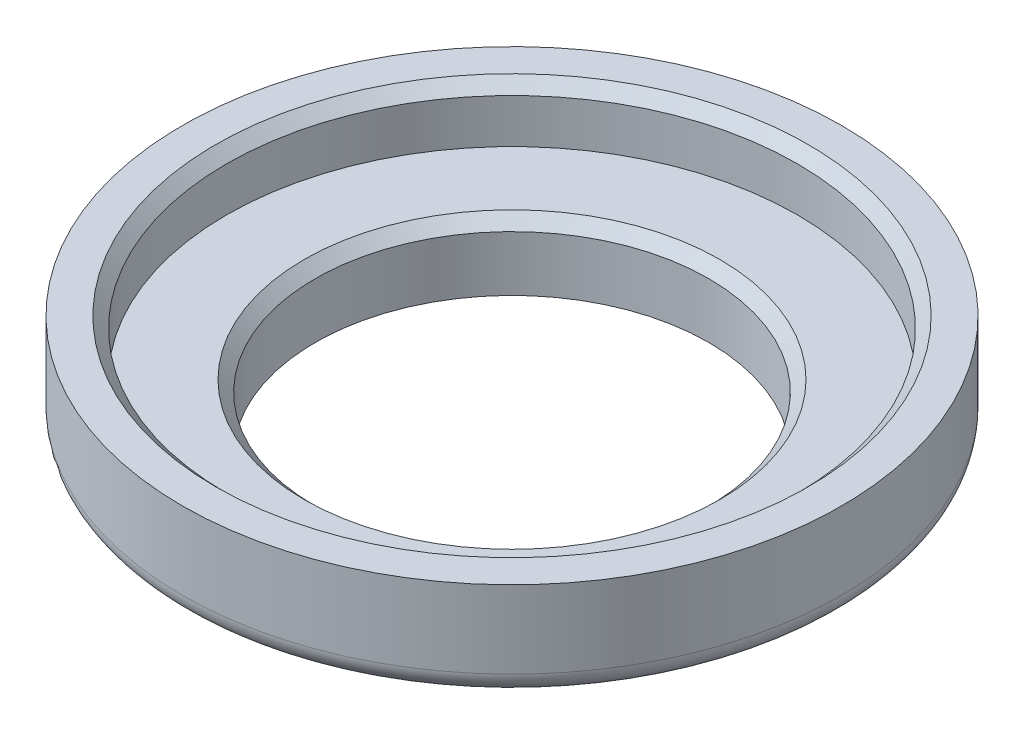
ISO-10303-21;
HEADER;
FILE_DESCRIPTION(('STEP AP214'),'2;1');
FILE_NAME('part.step','',(''),(''),'','','');
FILE_SCHEMA(('AUTOMOTIVE_DESIGN { 1 0 10303 214 1 1 1 1 }'));
ENDSEC;
DATA;
#1=APPLICATION_CONTEXT('core data for automotive mechanical design processes');
#2=APPLICATION_PROTOCOL_DEFINITION('international standard','automotive_design',2000,#1);
#3=PRODUCT_CONTEXT('',#1,'mechanical');
#4=PRODUCT('Part','Part','',(#3));
#5=PRODUCT_RELATED_PRODUCT_CATEGORY('part','',(#4));
#6=PRODUCT_DEFINITION_FORMATION('','',#4);
#7=PRODUCT_DEFINITION_CONTEXT('part definition',#1,'design');
#8=PRODUCT_DEFINITION('design','',#6,#7);
#9=PRODUCT_DEFINITION_SHAPE('','',#8);
#10=(LENGTH_UNIT() NAMED_UNIT(*) SI_UNIT(.MILLI.,.METRE.));
#11=(NAMED_UNIT(*) PLANE_ANGLE_UNIT() SI_UNIT($,.RADIAN.));
#12=(NAMED_UNIT(*) SI_UNIT($,.STERADIAN.) SOLID_ANGLE_UNIT());
#13=UNCERTAINTY_MEASURE_WITH_UNIT(LENGTH_MEASURE(1.E-05),#10,'distance_accuracy_value','');
#14=(GEOMETRIC_REPRESENTATION_CONTEXT(3) GLOBAL_UNCERTAINTY_ASSIGNED_CONTEXT((#13)) GLOBAL_UNIT_ASSIGNED_CONTEXT((#10,
#11,#12)) REPRESENTATION_CONTEXT('',''));
#15=CARTESIAN_POINT('',(0.,0.,0.));
#16=DIRECTION('',(0.,0.,1.));
#17=DIRECTION('',(1.,0.,0.));
#18=AXIS2_PLACEMENT_3D('',#15,#16,#17);
#19=CARTESIAN_POINT('',(14.9,5.5,0.));
#20=DIRECTION('',(0.,1.,0.));
#21=DIRECTION('',(0.,0.,1.));
#22=AXIS2_PLACEMENT_3D('',#19,#20,#21);
#23=PLANE('',#22);
#24=CARTESIAN_POINT('',(0.,5.5,0.));
#25=DIRECTION('',(0.,1.,0.));
#26=DIRECTION('',(0.,0.,1.));
#27=AXIS2_PLACEMENT_3D('',#24,#25,#26);
#28=CIRCLE('',#27,13.4);
#29=CARTESIAN_POINT('',(0.,5.5,13.4));
#30=VERTEX_POINT('',#29);
#31=EDGE_CURVE('E54',#30,#30,#28,.F.);
#32=ORIENTED_EDGE('',*,*,#31,.T.);
#33=EDGE_LOOP('',(#32));
#34=FACE_BOUND('',#33,.T.);
#35=CARTESIAN_POINT('',(0.,5.5,0.));
#36=DIRECTION('',(0.,-1.,0.));
#37=DIRECTION('',(0.,0.,-1.));
#38=AXIS2_PLACEMENT_3D('',#35,#36,#37);
#39=CIRCLE('',#38,14.9);
#40=CARTESIAN_POINT('',(0.,5.5,-14.9));
#41=VERTEX_POINT('',#40);
#42=EDGE_CURVE('E94',#41,#41,#39,.T.);
#43=ORIENTED_EDGE('',*,*,#42,.F.);
#44=EDGE_LOOP('',(#43));
#45=FACE_BOUND('',#44,.T.);
#46=ADVANCED_FACE('F45',(#34,#45),#23,.T.);
#47=CARTESIAN_POINT('',(0.,0.,0.));
#48=DIRECTION('',(0.,-1.,0.));
#49=DIRECTION('',(0.,0.,-1.));
#50=AXIS2_PLACEMENT_3D('',#47,#48,#49);
#51=CYLINDRICAL_SURFACE('',#50,12.9);
#52=CARTESIAN_POINT('',(0.,5.,0.));
#53=DIRECTION('',(0.,1.,0.));
#54=DIRECTION('',(0.,0.,1.));
#55=AXIS2_PLACEMENT_3D('',#52,#53,#54);
#56=CIRCLE('',#55,12.9);
#57=CARTESIAN_POINT('',(0.,5.,12.9));
#58=VERTEX_POINT('',#57);
#59=EDGE_CURVE('E10',#58,#58,#56,.T.);
#60=ORIENTED_EDGE('',*,*,#59,.T.);
#61=EDGE_LOOP('',(#60));
#62=FACE_BOUND('',#61,.T.);
#63=CARTESIAN_POINT('',(0.,3.,0.));
#64=DIRECTION('',(0.,-1.,0.));
#65=DIRECTION('',(0.,0.,-1.));
#66=AXIS2_PLACEMENT_3D('',#63,#64,#65);
#67=CIRCLE('',#66,12.9);
#68=CARTESIAN_POINT('',(0.,3.,-12.9));
#69=VERTEX_POINT('',#68);
#70=EDGE_CURVE('E78',#69,#69,#67,.T.);
#71=ORIENTED_EDGE('',*,*,#70,.T.);
#72=EDGE_LOOP('',(#71));
#73=FACE_BOUND('',#72,.T.);
#74=ADVANCED_FACE('F102',(#62,#73),#51,.F.);
#75=CARTESIAN_POINT('',(12.9,3.,0.));
#76=DIRECTION('',(0.,1.,0.));
#77=DIRECTION('',(0.,0.,1.));
#78=AXIS2_PLACEMENT_3D('',#75,#76,#77);
#79=PLANE('',#78);
#80=CARTESIAN_POINT('',(0.,3.,0.));
#81=DIRECTION('',(0.,1.,0.));
#82=DIRECTION('',(0.,0.,1.));
#83=AXIS2_PLACEMENT_3D('',#80,#81,#82);
#84=CIRCLE('',#83,9.4);
#85=CARTESIAN_POINT('',(0.,3.,9.4));
#86=VERTEX_POINT('',#85);
#87=EDGE_CURVE('E64',#86,#86,#84,.F.);
#88=ORIENTED_EDGE('',*,*,#87,.T.);
#89=EDGE_LOOP('',(#88));
#90=FACE_BOUND('',#89,.T.);
#91=ORIENTED_EDGE('',*,*,#70,.F.);
#92=EDGE_LOOP('',(#91));
#93=FACE_BOUND('',#92,.T.);
#94=ADVANCED_FACE('F107',(#90,#93),#79,.T.);
#95=CARTESIAN_POINT('',(0.,0.,0.));
#96=DIRECTION('',(0.,-1.,0.));
#97=DIRECTION('',(0.,0.,-1.));
#98=AXIS2_PLACEMENT_3D('',#95,#96,#97);
#99=CYLINDRICAL_SURFACE('',#98,8.9);
#100=CARTESIAN_POINT('',(0.,2.5,0.));
#101=DIRECTION('',(0.,1.,0.));
#102=DIRECTION('',(0.,0.,1.));
#103=AXIS2_PLACEMENT_3D('',#100,#101,#102);
#104=CIRCLE('',#103,8.9);
#105=CARTESIAN_POINT('',(0.,2.5,8.9));
#106=VERTEX_POINT('',#105);
#107=EDGE_CURVE('E59',#106,#106,#104,.T.);
#108=ORIENTED_EDGE('',*,*,#107,.T.);
#109=EDGE_LOOP('',(#108));
#110=FACE_BOUND('',#109,.T.);
#111=CARTESIAN_POINT('',(0.,0.,0.));
#112=DIRECTION('',(0.,-1.,0.));
#113=DIRECTION('',(0.,0.,-1.));
#114=AXIS2_PLACEMENT_3D('',#111,#112,#113);
#115=CIRCLE('',#114,8.9);
#116=CARTESIAN_POINT('',(0.,0.,-8.9));
#117=VERTEX_POINT('',#116);
#118=EDGE_CURVE('E82',#117,#117,#115,.T.);
#119=ORIENTED_EDGE('',*,*,#118,.T.);
#120=EDGE_LOOP('',(#119));
#121=FACE_BOUND('',#120,.T.);
#122=ADVANCED_FACE('F130',(#110,#121),#99,.F.);
#123=CARTESIAN_POINT('',(8.9,0.,0.));
#124=DIRECTION('',(0.,-1.,0.));
#125=DIRECTION('',(0.,0.,-1.));
#126=AXIS2_PLACEMENT_3D('',#123,#124,#125);
#127=PLANE('',#126);
#128=CARTESIAN_POINT('',(0.,0.,0.));
#129=DIRECTION('',(0.,-1.,0.));
#130=DIRECTION('',(0.,0.,-1.));
#131=AXIS2_PLACEMENT_3D('',#128,#129,#130);
#132=CIRCLE('',#131,10.9);
#133=CARTESIAN_POINT('',(0.,0.,-10.9));
#134=VERTEX_POINT('',#133);
#135=EDGE_CURVE('E86',#134,#134,#132,.T.);
#136=ORIENTED_EDGE('',*,*,#135,.T.);
#137=EDGE_LOOP('',(#136));
#138=FACE_BOUND('',#137,.T.);
#139=ORIENTED_EDGE('',*,*,#118,.F.);
#140=EDGE_LOOP('',(#139));
#141=FACE_BOUND('',#140,.T.);
#142=ADVANCED_FACE('F136',(#138,#141),#127,.T.);
#143=CARTESIAN_POINT('',(0.,0.,0.));
#144=DIRECTION('',(0.,-1.,0.));
#145=DIRECTION('',(0.,0.,-1.));
#146=AXIS2_PLACEMENT_3D('',#143,#144,#145);
#147=CYLINDRICAL_SURFACE('',#146,10.9);
#148=CARTESIAN_POINT('',(0.,1.,0.));
#149=DIRECTION('',(0.,-1.,0.));
#150=DIRECTION('',(0.,0.,-1.));
#151=AXIS2_PLACEMENT_3D('',#148,#149,#150);
#152=CIRCLE('',#151,10.9);
#153=CARTESIAN_POINT('',(0.,1.,-10.9));
#154=VERTEX_POINT('',#153);
#155=EDGE_CURVE('E90',#154,#154,#152,.T.);
#156=ORIENTED_EDGE('',*,*,#155,.T.);
#157=EDGE_LOOP('',(#156));
#158=FACE_BOUND('',#157,.T.);
#159=ORIENTED_EDGE('',*,*,#135,.F.);
#160=EDGE_LOOP('',(#159));
#161=FACE_BOUND('',#160,.T.);
#162=ADVANCED_FACE('F142',(#158,#161),#147,.T.);
#163=CARTESIAN_POINT('',(10.9,1.,0.));
#164=DIRECTION('',(0.,-1.,0.));
#165=DIRECTION('',(0.,0.,-1.));
#166=AXIS2_PLACEMENT_3D('',#163,#164,#165);
#167=PLANE('',#166);
#168=CARTESIAN_POINT('',(0.,1.,0.));
#169=DIRECTION('',(0.,-1.,0.));
#170=DIRECTION('',(0.,0.,-1.));
#171=AXIS2_PLACEMENT_3D('',#168,#169,#170);
#172=CIRCLE('',#171,13.9);
#173=CARTESIAN_POINT('',(0.,1.,-13.9));
#174=VERTEX_POINT('',#173);
#175=EDGE_CURVE('E74',#174,#174,#172,.T.);
#176=ORIENTED_EDGE('',*,*,#175,.T.);
#177=EDGE_LOOP('',(#176));
#178=FACE_BOUND('',#177,.T.);
#179=ORIENTED_EDGE('',*,*,#155,.F.);
#180=EDGE_LOOP('',(#179));
#181=FACE_BOUND('',#180,.T.);
#182=ADVANCED_FACE('F146',(#178,#181),#167,.T.);
#183=CARTESIAN_POINT('',(0.,0.,0.));
#184=DIRECTION('',(0.,-1.,0.));
#185=DIRECTION('',(0.,0.,-1.));
#186=AXIS2_PLACEMENT_3D('',#183,#184,#185);
#187=CYLINDRICAL_SURFACE('',#186,14.9);
#188=CARTESIAN_POINT('',(0.,2.,0.));
#189=DIRECTION('',(0.,-1.,0.));
#190=DIRECTION('',(0.,0.,-1.));
#191=AXIS2_PLACEMENT_3D('',#188,#189,#190);
#192=CIRCLE('',#191,14.9);
#193=CARTESIAN_POINT('',(0.,2.,-14.9));
#194=VERTEX_POINT('',#193);
#195=EDGE_CURVE('E70',#194,#194,#192,.F.);
#196=ORIENTED_EDGE('',*,*,#195,.T.);
#197=EDGE_LOOP('',(#196));
#198=FACE_BOUND('',#197,.T.);
#199=ORIENTED_EDGE('',*,*,#42,.T.);
#200=EDGE_LOOP('',(#199));
#201=FACE_BOUND('',#200,.T.);
#202=ADVANCED_FACE('F99',(#198,#201),#187,.T.);
#203=CARTESIAN_POINT('',(0.,2.,0.));
#204=DIRECTION('',(0.,-1.,0.));
#205=DIRECTION('',(0.,0.,-1.));
#206=AXIS2_PLACEMENT_3D('',#203,#204,#205);
#207=TOROIDAL_SURFACE('',#206,13.9,1.);
#208=ORIENTED_EDGE('',*,*,#195,.F.);
#209=EDGE_LOOP('',(#208));
#210=FACE_BOUND('',#209,.T.);
#211=ORIENTED_EDGE('',*,*,#175,.F.);
#212=EDGE_LOOP('',(#211));
#213=FACE_BOUND('',#212,.T.);
#214=ADVANCED_FACE('F111',(#210,#213),#207,.T.);
#215=CARTESIAN_POINT('',(0.,3.,0.));
#216=DIRECTION('',(0.,1.,0.));
#217=DIRECTION('',(0.,0.,1.));
#218=AXIS2_PLACEMENT_3D('',#215,#216,#217);
#219=CONICAL_SURFACE('',#218,9.4,0.785398163397448);
#220=ORIENTED_EDGE('',*,*,#107,.F.);
#221=EDGE_LOOP('',(#220));
#222=FACE_BOUND('',#221,.T.);
#223=ORIENTED_EDGE('',*,*,#87,.F.);
#224=EDGE_LOOP('',(#223));
#225=FACE_BOUND('',#224,.T.);
#226=ADVANCED_FACE('F113',(#222,#225),#219,.F.);
#227=CARTESIAN_POINT('',(0.,5.5,0.));
#228=DIRECTION('',(0.,1.,0.));
#229=DIRECTION('',(0.,0.,1.));
#230=AXIS2_PLACEMENT_3D('',#227,#228,#229);
#231=CONICAL_SURFACE('',#230,13.4,0.785398163397447);
#232=ORIENTED_EDGE('',*,*,#59,.F.);
#233=EDGE_LOOP('',(#232));
#234=FACE_BOUND('',#233,.T.);
#235=ORIENTED_EDGE('',*,*,#31,.F.);
#236=EDGE_LOOP('',(#235));
#237=FACE_BOUND('',#236,.T.);
#238=ADVANCED_FACE('F48',(#234,#237),#231,.F.);
#239=CLOSED_SHELL('',(#46,#74,#94,#122,#142,#162,#182,#202,#214,#226,#238));
#240=MANIFOLD_SOLID_BREP('B2',#239);
#241=ADVANCED_BREP_SHAPE_REPRESENTATION('',(#18,#240),#14);
#242=SHAPE_DEFINITION_REPRESENTATION(#9,#241);
ENDSEC;
END-ISO-10303-21;
